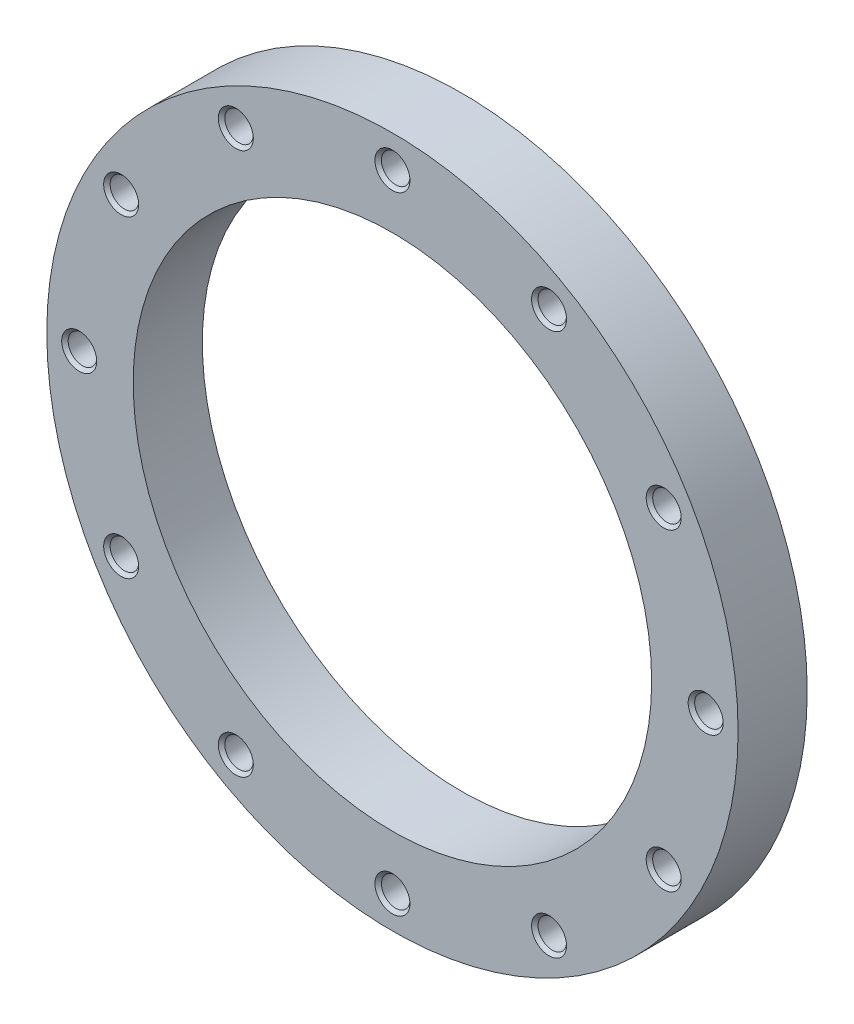
ISO-10303-21;
HEADER;
FILE_DESCRIPTION(('STEP AP214'),'2;1');
FILE_NAME('part.step','',(''),(''),'','','');
FILE_SCHEMA(('AUTOMOTIVE_DESIGN { 1 0 10303 214 1 1 1 1 }'));
ENDSEC;
DATA;
#1=APPLICATION_CONTEXT('core data for automotive mechanical design processes');
#2=APPLICATION_PROTOCOL_DEFINITION('international standard','automotive_design',2000,#1);
#3=PRODUCT_CONTEXT('',#1,'mechanical');
#4=PRODUCT('Part','Part','',(#3));
#5=PRODUCT_RELATED_PRODUCT_CATEGORY('part','',(#4));
#6=PRODUCT_DEFINITION_FORMATION('','',#4);
#7=PRODUCT_DEFINITION_CONTEXT('part definition',#1,'design');
#8=PRODUCT_DEFINITION('design','',#6,#7);
#9=PRODUCT_DEFINITION_SHAPE('','',#8);
#10=(LENGTH_UNIT() NAMED_UNIT(*) SI_UNIT(.MILLI.,.METRE.));
#11=(NAMED_UNIT(*) PLANE_ANGLE_UNIT() SI_UNIT($,.RADIAN.));
#12=(NAMED_UNIT(*) SI_UNIT($,.STERADIAN.) SOLID_ANGLE_UNIT());
#13=UNCERTAINTY_MEASURE_WITH_UNIT(LENGTH_MEASURE(1.E-05),#10,'distance_accuracy_value','');
#14=(GEOMETRIC_REPRESENTATION_CONTEXT(3) GLOBAL_UNCERTAINTY_ASSIGNED_CONTEXT((#13)) GLOBAL_UNIT_ASSIGNED_CONTEXT((#10,
#11,#12)) REPRESENTATION_CONTEXT('',''));
#15=CARTESIAN_POINT('',(0.,0.,0.));
#16=DIRECTION('',(0.,0.,1.));
#17=DIRECTION('',(1.,0.,0.));
#18=AXIS2_PLACEMENT_3D('',#15,#16,#17);
#19=CARTESIAN_POINT('',(0.,0.,-8.));
#20=DIRECTION('',(0.,0.,1.));
#21=DIRECTION('',(1.,0.,0.));
#22=AXIS2_PLACEMENT_3D('',#19,#20,#21);
#23=CYLINDRICAL_SURFACE('',#22,40.);
#24=CARTESIAN_POINT('',(0.,0.,-8.));
#25=DIRECTION('',(0.,0.,1.));
#26=DIRECTION('',(1.,0.,0.));
#27=AXIS2_PLACEMENT_3D('',#24,#25,#26);
#28=CIRCLE('',#27,40.);
#29=CARTESIAN_POINT('',(40.,0.,-8.));
#30=VERTEX_POINT('',#29);
#31=EDGE_CURVE('E10',#30,#30,#28,.T.);
#32=ORIENTED_EDGE('',*,*,#31,.T.);
#33=EDGE_LOOP('',(#32));
#34=FACE_BOUND('',#33,.T.);
#35=CARTESIAN_POINT('',(0.,0.,0.));
#36=DIRECTION('',(0.,0.,1.));
#37=DIRECTION('',(1.,0.,0.));
#38=AXIS2_PLACEMENT_3D('',#35,#36,#37);
#39=CIRCLE('',#38,40.);
#40=CARTESIAN_POINT('',(40.,0.,0.));
#41=VERTEX_POINT('',#40);
#42=EDGE_CURVE('E44',#41,#41,#39,.T.);
#43=ORIENTED_EDGE('',*,*,#42,.F.);
#44=EDGE_LOOP('',(#43));
#45=FACE_BOUND('',#44,.T.);
#46=ADVANCED_FACE('F41',(#34,#45),#23,.T.);
#47=CARTESIAN_POINT('',(0.,0.,-8.));
#48=DIRECTION('',(0.,0.,1.));
#49=DIRECTION('',(1.,0.,0.));
#50=AXIS2_PLACEMENT_3D('',#47,#48,#49);
#51=PLANE('',#50);
#52=CARTESIAN_POINT('',(-18.1249999999996,31.3934208871861,-8.));
#53=DIRECTION('',(0.,0.,1.));
#54=DIRECTION('',(1.,0.,0.));
#55=AXIS2_PLACEMENT_3D('',#52,#53,#54);
#56=CIRCLE('',#55,1.65);
#57=CARTESIAN_POINT('',(-16.4749999999996,31.3934208871861,-8.));
#58=VERTEX_POINT('',#57);
#59=EDGE_CURVE('E194',#58,#58,#56,.T.);
#60=ORIENTED_EDGE('',*,*,#59,.T.);
#61=EDGE_LOOP('',(#60));
#62=FACE_BOUND('',#61,.T.);
#63=CARTESIAN_POINT('',(-31.3934208871857,18.1250000000004,-8.));
#64=DIRECTION('',(0.,0.,1.));
#65=DIRECTION('',(1.,0.,0.));
#66=AXIS2_PLACEMENT_3D('',#63,#64,#65);
#67=CIRCLE('',#66,1.65);
#68=CARTESIAN_POINT('',(-29.7434208871857,18.1250000000004,-8.));
#69=VERTEX_POINT('',#68);
#70=EDGE_CURVE('E182',#69,#69,#67,.T.);
#71=ORIENTED_EDGE('',*,*,#70,.T.);
#72=EDGE_LOOP('',(#71));
#73=FACE_BOUND('',#72,.T.);
#74=CARTESIAN_POINT('',(-36.25,3.79698595599191E-13,-8.));
#75=DIRECTION('',(0.,0.,1.));
#76=DIRECTION('',(1.,0.,0.));
#77=AXIS2_PLACEMENT_3D('',#74,#75,#76);
#78=CIRCLE('',#77,1.65);
#79=CARTESIAN_POINT('',(-34.6,3.79698595599191E-13,-8.));
#80=VERTEX_POINT('',#79);
#81=EDGE_CURVE('E170',#80,#80,#78,.T.);
#82=ORIENTED_EDGE('',*,*,#81,.T.);
#83=EDGE_LOOP('',(#82));
#84=FACE_BOUND('',#83,.T.);
#85=CARTESIAN_POINT('',(-31.3934208871861,-18.1249999999997,-8.));
#86=DIRECTION('',(0.,0.,1.));
#87=DIRECTION('',(1.,0.,0.));
#88=AXIS2_PLACEMENT_3D('',#85,#86,#87);
#89=CIRCLE('',#88,1.65);
#90=CARTESIAN_POINT('',(-29.7434208871861,-18.1249999999997,-8.));
#91=VERTEX_POINT('',#90);
#92=EDGE_CURVE('E158',#91,#91,#89,.T.);
#93=ORIENTED_EDGE('',*,*,#92,.T.);
#94=EDGE_LOOP('',(#93));
#95=FACE_BOUND('',#94,.T.);
#96=CARTESIAN_POINT('',(-18.1250000000003,-31.3934208871858,-8.));
#97=DIRECTION('',(0.,0.,1.));
#98=DIRECTION('',(1.,0.,0.));
#99=AXIS2_PLACEMENT_3D('',#96,#97,#98);
#100=CIRCLE('',#99,1.65);
#101=CARTESIAN_POINT('',(-16.4750000000003,-31.3934208871858,-8.));
#102=VERTEX_POINT('',#101);
#103=EDGE_CURVE('E146',#102,#102,#100,.T.);
#104=ORIENTED_EDGE('',*,*,#103,.T.);
#105=EDGE_LOOP('',(#104));
#106=FACE_BOUND('',#105,.T.);
#107=CARTESIAN_POINT('',(0.,-36.25,-8.));
#108=DIRECTION('',(0.,0.,1.));
#109=DIRECTION('',(1.,0.,0.));
#110=AXIS2_PLACEMENT_3D('',#107,#108,#109);
#111=CIRCLE('',#110,1.65);
#112=CARTESIAN_POINT('',(1.65,-36.25,-8.));
#113=VERTEX_POINT('',#112);
#114=EDGE_CURVE('E134',#113,#113,#111,.T.);
#115=ORIENTED_EDGE('',*,*,#114,.T.);
#116=EDGE_LOOP('',(#115));
#117=FACE_BOUND('',#116,.T.);
#118=CARTESIAN_POINT('',(18.1249999999998,-31.393420887186,-8.));
#119=DIRECTION('',(0.,0.,1.));
#120=DIRECTION('',(1.,0.,0.));
#121=AXIS2_PLACEMENT_3D('',#118,#119,#120);
#122=CIRCLE('',#121,1.65);
#123=CARTESIAN_POINT('',(19.7749999999998,-31.393420887186,-8.));
#124=VERTEX_POINT('',#123);
#125=EDGE_CURVE('E122',#124,#124,#122,.T.);
#126=ORIENTED_EDGE('',*,*,#125,.T.);
#127=EDGE_LOOP('',(#126));
#128=FACE_BOUND('',#127,.T.);
#129=CARTESIAN_POINT('',(31.3934208871858,-18.1250000000001,-8.));
#130=DIRECTION('',(0.,0.,1.));
#131=DIRECTION('',(1.,0.,0.));
#132=AXIS2_PLACEMENT_3D('',#129,#130,#131);
#133=CIRCLE('',#132,1.65);
#134=CARTESIAN_POINT('',(33.0434208871858,-18.1250000000001,-8.));
#135=VERTEX_POINT('',#134);
#136=EDGE_CURVE('E110',#135,#135,#133,.T.);
#137=ORIENTED_EDGE('',*,*,#136,.T.);
#138=EDGE_LOOP('',(#137));
#139=FACE_BOUND('',#138,.T.);
#140=CARTESIAN_POINT('',(36.25,-1.26566198533064E-13,-8.));
#141=DIRECTION('',(0.,0.,1.));
#142=DIRECTION('',(1.,0.,0.));
#143=AXIS2_PLACEMENT_3D('',#140,#141,#142);
#144=CIRCLE('',#143,1.65);
#145=CARTESIAN_POINT('',(37.9,-1.26566198533064E-13,-8.));
#146=VERTEX_POINT('',#145);
#147=EDGE_CURVE('E98',#146,#146,#144,.T.);
#148=ORIENTED_EDGE('',*,*,#147,.T.);
#149=EDGE_LOOP('',(#148));
#150=FACE_BOUND('',#149,.T.);
#151=CARTESIAN_POINT('',(31.3934208871859,18.1249999999999,-8.));
#152=DIRECTION('',(0.,0.,1.));
#153=DIRECTION('',(1.,0.,0.));
#154=AXIS2_PLACEMENT_3D('',#151,#152,#153);
#155=CIRCLE('',#154,1.65);
#156=CARTESIAN_POINT('',(33.0434208871859,18.1249999999999,-8.));
#157=VERTEX_POINT('',#156);
#158=EDGE_CURVE('E86',#157,#157,#155,.T.);
#159=ORIENTED_EDGE('',*,*,#158,.T.);
#160=EDGE_LOOP('',(#159));
#161=FACE_BOUND('',#160,.T.);
#162=CARTESIAN_POINT('',(18.125,31.3934208871859,-8.));
#163=DIRECTION('',(0.,0.,1.));
#164=DIRECTION('',(1.,0.,0.));
#165=AXIS2_PLACEMENT_3D('',#162,#163,#164);
#166=CIRCLE('',#165,1.65);
#167=CARTESIAN_POINT('',(19.775,31.3934208871859,-8.));
#168=VERTEX_POINT('',#167);
#169=EDGE_CURVE('E74',#168,#168,#166,.T.);
#170=ORIENTED_EDGE('',*,*,#169,.T.);
#171=EDGE_LOOP('',(#170));
#172=FACE_BOUND('',#171,.T.);
#173=CARTESIAN_POINT('',(0.,36.25,-8.));
#174=DIRECTION('',(0.,0.,1.));
#175=DIRECTION('',(1.,0.,0.));
#176=AXIS2_PLACEMENT_3D('',#173,#174,#175);
#177=CIRCLE('',#176,1.65);
#178=CARTESIAN_POINT('',(1.65,36.25,-8.));
#179=VERTEX_POINT('',#178);
#180=EDGE_CURVE('E59',#179,#179,#177,.T.);
#181=ORIENTED_EDGE('',*,*,#180,.T.);
#182=EDGE_LOOP('',(#181));
#183=FACE_BOUND('',#182,.T.);
#184=CARTESIAN_POINT('',(0.,0.,-8.));
#185=DIRECTION('',(0.,0.,1.));
#186=DIRECTION('',(1.,0.,0.));
#187=AXIS2_PLACEMENT_3D('',#184,#185,#186);
#188=CIRCLE('',#187,30.);
#189=CARTESIAN_POINT('',(30.,0.,-8.));
#190=VERTEX_POINT('',#189);
#191=EDGE_CURVE('E53',#190,#190,#188,.T.);
#192=ORIENTED_EDGE('',*,*,#191,.T.);
#193=EDGE_LOOP('',(#192));
#194=FACE_BOUND('',#193,.T.);
#195=ORIENTED_EDGE('',*,*,#31,.F.);
#196=EDGE_LOOP('',(#195));
#197=FACE_BOUND('',#196,.T.);
#198=ADVANCED_FACE('F213',(#62,#73,#84,#95,#106,#117,#128,#139,#150,#161,#172,#183,#194,#197),
#51,.F.);
#199=CARTESIAN_POINT('',(0.,0.,0.));
#200=DIRECTION('',(0.,0.,1.));
#201=DIRECTION('',(1.,0.,0.));
#202=AXIS2_PLACEMENT_3D('',#199,#200,#201);
#203=PLANE('',#202);
#204=CARTESIAN_POINT('',(-18.1249999999996,31.3934208871861,0.));
#205=DIRECTION('',(0.,0.,1.));
#206=DIRECTION('',(1.,0.,0.));
#207=AXIS2_PLACEMENT_3D('',#204,#205,#206);
#208=CIRCLE('',#207,2.025);
#209=CARTESIAN_POINT('',(-16.0999999999996,31.3934208871861,0.));
#210=VERTEX_POINT('',#209);
#211=EDGE_CURVE('E202',#210,#210,#208,.T.);
#212=ORIENTED_EDGE('',*,*,#211,.F.);
#213=EDGE_LOOP('',(#212));
#214=FACE_BOUND('',#213,.T.);
#215=CARTESIAN_POINT('',(-31.3934208871857,18.1250000000004,0.));
#216=DIRECTION('',(0.,0.,1.));
#217=DIRECTION('',(1.,0.,0.));
#218=AXIS2_PLACEMENT_3D('',#215,#216,#217);
#219=CIRCLE('',#218,2.025);
#220=CARTESIAN_POINT('',(-29.3684208871857,18.1250000000004,0.));
#221=VERTEX_POINT('',#220);
#222=EDGE_CURVE('E190',#221,#221,#219,.T.);
#223=ORIENTED_EDGE('',*,*,#222,.F.);
#224=EDGE_LOOP('',(#223));
#225=FACE_BOUND('',#224,.T.);
#226=CARTESIAN_POINT('',(-36.25,3.79698595599191E-13,0.));
#227=DIRECTION('',(0.,0.,1.));
#228=DIRECTION('',(1.,0.,0.));
#229=AXIS2_PLACEMENT_3D('',#226,#227,#228);
#230=CIRCLE('',#229,2.025);
#231=CARTESIAN_POINT('',(-34.225,3.79698595599191E-13,0.));
#232=VERTEX_POINT('',#231);
#233=EDGE_CURVE('E178',#232,#232,#230,.T.);
#234=ORIENTED_EDGE('',*,*,#233,.F.);
#235=EDGE_LOOP('',(#234));
#236=FACE_BOUND('',#235,.T.);
#237=CARTESIAN_POINT('',(-31.3934208871861,-18.1249999999997,0.));
#238=DIRECTION('',(0.,0.,1.));
#239=DIRECTION('',(1.,0.,0.));
#240=AXIS2_PLACEMENT_3D('',#237,#238,#239);
#241=CIRCLE('',#240,2.025);
#242=CARTESIAN_POINT('',(-29.3684208871861,-18.1249999999997,0.));
#243=VERTEX_POINT('',#242);
#244=EDGE_CURVE('E166',#243,#243,#241,.T.);
#245=ORIENTED_EDGE('',*,*,#244,.F.);
#246=EDGE_LOOP('',(#245));
#247=FACE_BOUND('',#246,.T.);
#248=CARTESIAN_POINT('',(-18.1250000000003,-31.3934208871858,0.));
#249=DIRECTION('',(0.,0.,1.));
#250=DIRECTION('',(1.,0.,0.));
#251=AXIS2_PLACEMENT_3D('',#248,#249,#250);
#252=CIRCLE('',#251,2.025);
#253=CARTESIAN_POINT('',(-16.1000000000003,-31.3934208871858,0.));
#254=VERTEX_POINT('',#253);
#255=EDGE_CURVE('E154',#254,#254,#252,.T.);
#256=ORIENTED_EDGE('',*,*,#255,.F.);
#257=EDGE_LOOP('',(#256));
#258=FACE_BOUND('',#257,.T.);
#259=CARTESIAN_POINT('',(0.,-36.25,0.));
#260=DIRECTION('',(0.,0.,1.));
#261=DIRECTION('',(1.,0.,0.));
#262=AXIS2_PLACEMENT_3D('',#259,#260,#261);
#263=CIRCLE('',#262,2.025);
#264=CARTESIAN_POINT('',(2.025,-36.25,0.));
#265=VERTEX_POINT('',#264);
#266=EDGE_CURVE('E142',#265,#265,#263,.T.);
#267=ORIENTED_EDGE('',*,*,#266,.F.);
#268=EDGE_LOOP('',(#267));
#269=FACE_BOUND('',#268,.T.);
#270=CARTESIAN_POINT('',(18.1249999999998,-31.393420887186,0.));
#271=DIRECTION('',(0.,0.,1.));
#272=DIRECTION('',(1.,0.,0.));
#273=AXIS2_PLACEMENT_3D('',#270,#271,#272);
#274=CIRCLE('',#273,2.025);
#275=CARTESIAN_POINT('',(20.1499999999998,-31.393420887186,0.));
#276=VERTEX_POINT('',#275);
#277=EDGE_CURVE('E130',#276,#276,#274,.T.);
#278=ORIENTED_EDGE('',*,*,#277,.F.);
#279=EDGE_LOOP('',(#278));
#280=FACE_BOUND('',#279,.T.);
#281=CARTESIAN_POINT('',(31.3934208871858,-18.1250000000001,0.));
#282=DIRECTION('',(0.,0.,1.));
#283=DIRECTION('',(1.,0.,0.));
#284=AXIS2_PLACEMENT_3D('',#281,#282,#283);
#285=CIRCLE('',#284,2.025);
#286=CARTESIAN_POINT('',(33.4184208871858,-18.1250000000001,0.));
#287=VERTEX_POINT('',#286);
#288=EDGE_CURVE('E118',#287,#287,#285,.T.);
#289=ORIENTED_EDGE('',*,*,#288,.F.);
#290=EDGE_LOOP('',(#289));
#291=FACE_BOUND('',#290,.T.);
#292=CARTESIAN_POINT('',(36.25,-1.26566198533064E-13,0.));
#293=DIRECTION('',(0.,0.,1.));
#294=DIRECTION('',(1.,0.,0.));
#295=AXIS2_PLACEMENT_3D('',#292,#293,#294);
#296=CIRCLE('',#295,2.025);
#297=CARTESIAN_POINT('',(38.275,-1.26566198533064E-13,0.));
#298=VERTEX_POINT('',#297);
#299=EDGE_CURVE('E106',#298,#298,#296,.T.);
#300=ORIENTED_EDGE('',*,*,#299,.F.);
#301=EDGE_LOOP('',(#300));
#302=FACE_BOUND('',#301,.T.);
#303=CARTESIAN_POINT('',(31.3934208871859,18.1249999999999,0.));
#304=DIRECTION('',(0.,0.,1.));
#305=DIRECTION('',(1.,0.,0.));
#306=AXIS2_PLACEMENT_3D('',#303,#304,#305);
#307=CIRCLE('',#306,2.025);
#308=CARTESIAN_POINT('',(33.4184208871859,18.1249999999999,0.));
#309=VERTEX_POINT('',#308);
#310=EDGE_CURVE('E94',#309,#309,#307,.T.);
#311=ORIENTED_EDGE('',*,*,#310,.F.);
#312=EDGE_LOOP('',(#311));
#313=FACE_BOUND('',#312,.T.);
#314=CARTESIAN_POINT('',(18.125,31.3934208871859,0.));
#315=DIRECTION('',(0.,0.,1.));
#316=DIRECTION('',(1.,0.,0.));
#317=AXIS2_PLACEMENT_3D('',#314,#315,#316);
#318=CIRCLE('',#317,2.025);
#319=CARTESIAN_POINT('',(20.15,31.3934208871859,0.));
#320=VERTEX_POINT('',#319);
#321=EDGE_CURVE('E82',#320,#320,#318,.T.);
#322=ORIENTED_EDGE('',*,*,#321,.F.);
#323=EDGE_LOOP('',(#322));
#324=FACE_BOUND('',#323,.T.);
#325=CARTESIAN_POINT('',(0.,36.25,0.));
#326=DIRECTION('',(0.,0.,1.));
#327=DIRECTION('',(1.,0.,0.));
#328=AXIS2_PLACEMENT_3D('',#325,#326,#327);
#329=CIRCLE('',#328,2.025);
#330=CARTESIAN_POINT('',(2.025,36.25,0.));
#331=VERTEX_POINT('',#330);
#332=EDGE_CURVE('E70',#331,#331,#329,.T.);
#333=ORIENTED_EDGE('',*,*,#332,.F.);
#334=EDGE_LOOP('',(#333));
#335=FACE_BOUND('',#334,.T.);
#336=CARTESIAN_POINT('',(0.,0.,0.));
#337=DIRECTION('',(0.,0.,1.));
#338=DIRECTION('',(1.,0.,0.));
#339=AXIS2_PLACEMENT_3D('',#336,#337,#338);
#340=CIRCLE('',#339,30.);
#341=CARTESIAN_POINT('',(30.,0.,0.));
#342=VERTEX_POINT('',#341);
#343=EDGE_CURVE('E55',#342,#342,#340,.T.);
#344=ORIENTED_EDGE('',*,*,#343,.F.);
#345=EDGE_LOOP('',(#344));
#346=FACE_BOUND('',#345,.T.);
#347=ORIENTED_EDGE('',*,*,#42,.T.);
#348=EDGE_LOOP('',(#347));
#349=FACE_BOUND('',#348,.T.);
#350=ADVANCED_FACE('F209',(#214,#225,#236,#247,#258,#269,#280,#291,#302,#313,#324,#335,#346,
#349),#203,.T.);
#351=CARTESIAN_POINT('',(0.,0.,-8.));
#352=DIRECTION('',(0.,0.,1.));
#353=DIRECTION('',(1.,0.,0.));
#354=AXIS2_PLACEMENT_3D('',#351,#352,#353);
#355=CYLINDRICAL_SURFACE('',#354,30.);
#356=ORIENTED_EDGE('',*,*,#191,.F.);
#357=EDGE_LOOP('',(#356));
#358=FACE_BOUND('',#357,.T.);
#359=ORIENTED_EDGE('',*,*,#343,.T.);
#360=EDGE_LOOP('',(#359));
#361=FACE_BOUND('',#360,.T.);
#362=ADVANCED_FACE('F212',(#358,#361),#355,.F.);
#363=CARTESIAN_POINT('',(0.,36.25,0.));
#364=DIRECTION('',(0.,0.,1.));
#365=DIRECTION('',(1.,0.,0.));
#366=AXIS2_PLACEMENT_3D('',#363,#364,#365);
#367=CYLINDRICAL_SURFACE('',#366,1.65);
#368=ORIENTED_EDGE('',*,*,#180,.F.);
#369=EDGE_LOOP('',(#368));
#370=FACE_BOUND('',#369,.T.);
#371=CARTESIAN_POINT('',(0.,36.25,-0.375000000000001));
#372=DIRECTION('',(0.,0.,1.));
#373=DIRECTION('',(1.,0.,0.));
#374=AXIS2_PLACEMENT_3D('',#371,#372,#373);
#375=CIRCLE('',#374,1.65);
#376=CARTESIAN_POINT('',(1.65,36.25,-0.375000000000001));
#377=VERTEX_POINT('',#376);
#378=EDGE_CURVE('E66',#377,#377,#375,.T.);
#379=ORIENTED_EDGE('',*,*,#378,.T.);
#380=EDGE_LOOP('',(#379));
#381=FACE_BOUND('',#380,.T.);
#382=ADVANCED_FACE('F252',(#370,#381),#367,.F.);
#383=CARTESIAN_POINT('',(0.,36.25,0.));
#384=DIRECTION('',(0.,0.,1.));
#385=DIRECTION('',(1.,0.,0.));
#386=AXIS2_PLACEMENT_3D('',#383,#384,#385);
#387=CONICAL_SURFACE('',#386,2.025,0.785398163397445);
#388=ORIENTED_EDGE('',*,*,#378,.F.);
#389=EDGE_LOOP('',(#388));
#390=FACE_BOUND('',#389,.T.);
#391=ORIENTED_EDGE('',*,*,#332,.T.);
#392=EDGE_LOOP('',(#391));
#393=FACE_BOUND('',#392,.T.);
#394=ADVANCED_FACE('F256',(#390,#393),#387,.F.);
#395=CARTESIAN_POINT('',(18.125,31.3934208871859,0.));
#396=DIRECTION('',(0.,0.,1.));
#397=DIRECTION('',(1.,0.,0.));
#398=AXIS2_PLACEMENT_3D('',#395,#396,#397);
#399=CYLINDRICAL_SURFACE('',#398,1.65);
#400=ORIENTED_EDGE('',*,*,#169,.F.);
#401=EDGE_LOOP('',(#400));
#402=FACE_BOUND('',#401,.T.);
#403=CARTESIAN_POINT('',(18.125,31.3934208871859,-0.375000000000001));
#404=DIRECTION('',(0.,0.,1.));
#405=DIRECTION('',(1.,0.,0.));
#406=AXIS2_PLACEMENT_3D('',#403,#404,#405);
#407=CIRCLE('',#406,1.65);
#408=CARTESIAN_POINT('',(19.775,31.3934208871859,-0.375000000000001));
#409=VERTEX_POINT('',#408);
#410=EDGE_CURVE('E78',#409,#409,#407,.T.);
#411=ORIENTED_EDGE('',*,*,#410,.T.);
#412=EDGE_LOOP('',(#411));
#413=FACE_BOUND('',#412,.T.);
#414=ADVANCED_FACE('F260',(#402,#413),#399,.F.);
#415=CARTESIAN_POINT('',(18.125,31.3934208871859,0.));
#416=DIRECTION('',(0.,0.,1.));
#417=DIRECTION('',(1.,0.,0.));
#418=AXIS2_PLACEMENT_3D('',#415,#416,#417);
#419=CONICAL_SURFACE('',#418,2.025,0.785398163397445);
#420=ORIENTED_EDGE('',*,*,#410,.F.);
#421=EDGE_LOOP('',(#420));
#422=FACE_BOUND('',#421,.T.);
#423=ORIENTED_EDGE('',*,*,#321,.T.);
#424=EDGE_LOOP('',(#423));
#425=FACE_BOUND('',#424,.T.);
#426=ADVANCED_FACE('F264',(#422,#425),#419,.F.);
#427=CARTESIAN_POINT('',(31.3934208871859,18.1249999999999,0.));
#428=DIRECTION('',(0.,0.,1.));
#429=DIRECTION('',(1.,0.,0.));
#430=AXIS2_PLACEMENT_3D('',#427,#428,#429);
#431=CYLINDRICAL_SURFACE('',#430,1.65);
#432=ORIENTED_EDGE('',*,*,#158,.F.);
#433=EDGE_LOOP('',(#432));
#434=FACE_BOUND('',#433,.T.);
#435=CARTESIAN_POINT('',(31.3934208871859,18.1249999999999,-0.375000000000001));
#436=DIRECTION('',(0.,0.,1.));
#437=DIRECTION('',(1.,0.,0.));
#438=AXIS2_PLACEMENT_3D('',#435,#436,#437);
#439=CIRCLE('',#438,1.65);
#440=CARTESIAN_POINT('',(33.0434208871859,18.1249999999999,-0.375000000000001));
#441=VERTEX_POINT('',#440);
#442=EDGE_CURVE('E90',#441,#441,#439,.T.);
#443=ORIENTED_EDGE('',*,*,#442,.T.);
#444=EDGE_LOOP('',(#443));
#445=FACE_BOUND('',#444,.T.);
#446=ADVANCED_FACE('F268',(#434,#445),#431,.F.);
#447=CARTESIAN_POINT('',(31.3934208871859,18.1249999999999,0.));
#448=DIRECTION('',(0.,0.,1.));
#449=DIRECTION('',(1.,0.,0.));
#450=AXIS2_PLACEMENT_3D('',#447,#448,#449);
#451=CONICAL_SURFACE('',#450,2.025,0.785398163397445);
#452=ORIENTED_EDGE('',*,*,#442,.F.);
#453=EDGE_LOOP('',(#452));
#454=FACE_BOUND('',#453,.T.);
#455=ORIENTED_EDGE('',*,*,#310,.T.);
#456=EDGE_LOOP('',(#455));
#457=FACE_BOUND('',#456,.T.);
#458=ADVANCED_FACE('F272',(#454,#457),#451,.F.);
#459=CARTESIAN_POINT('',(36.25,-1.26566198533064E-13,0.));
#460=DIRECTION('',(0.,0.,1.));
#461=DIRECTION('',(1.,0.,0.));
#462=AXIS2_PLACEMENT_3D('',#459,#460,#461);
#463=CYLINDRICAL_SURFACE('',#462,1.65);
#464=ORIENTED_EDGE('',*,*,#147,.F.);
#465=EDGE_LOOP('',(#464));
#466=FACE_BOUND('',#465,.T.);
#467=CARTESIAN_POINT('',(36.25,-1.26566198533064E-13,-0.375000000000001));
#468=DIRECTION('',(0.,0.,1.));
#469=DIRECTION('',(1.,0.,0.));
#470=AXIS2_PLACEMENT_3D('',#467,#468,#469);
#471=CIRCLE('',#470,1.65);
#472=CARTESIAN_POINT('',(37.9,-1.26566198533064E-13,-0.375000000000001));
#473=VERTEX_POINT('',#472);
#474=EDGE_CURVE('E102',#473,#473,#471,.T.);
#475=ORIENTED_EDGE('',*,*,#474,.T.);
#476=EDGE_LOOP('',(#475));
#477=FACE_BOUND('',#476,.T.);
#478=ADVANCED_FACE('F276',(#466,#477),#463,.F.);
#479=CARTESIAN_POINT('',(36.25,-1.26566198533064E-13,0.));
#480=DIRECTION('',(0.,0.,1.));
#481=DIRECTION('',(1.,0.,0.));
#482=AXIS2_PLACEMENT_3D('',#479,#480,#481);
#483=CONICAL_SURFACE('',#482,2.025,0.785398163397445);
#484=ORIENTED_EDGE('',*,*,#474,.F.);
#485=EDGE_LOOP('',(#484));
#486=FACE_BOUND('',#485,.T.);
#487=ORIENTED_EDGE('',*,*,#299,.T.);
#488=EDGE_LOOP('',(#487));
#489=FACE_BOUND('',#488,.T.);
#490=ADVANCED_FACE('F280',(#486,#489),#483,.F.);
#491=CARTESIAN_POINT('',(31.3934208871858,-18.1250000000001,0.));
#492=DIRECTION('',(0.,0.,1.));
#493=DIRECTION('',(1.,0.,0.));
#494=AXIS2_PLACEMENT_3D('',#491,#492,#493);
#495=CYLINDRICAL_SURFACE('',#494,1.65);
#496=ORIENTED_EDGE('',*,*,#136,.F.);
#497=EDGE_LOOP('',(#496));
#498=FACE_BOUND('',#497,.T.);
#499=CARTESIAN_POINT('',(31.3934208871858,-18.1250000000001,-0.375000000000001));
#500=DIRECTION('',(0.,0.,1.));
#501=DIRECTION('',(1.,0.,0.));
#502=AXIS2_PLACEMENT_3D('',#499,#500,#501);
#503=CIRCLE('',#502,1.65);
#504=CARTESIAN_POINT('',(33.0434208871858,-18.1250000000001,-0.375000000000001));
#505=VERTEX_POINT('',#504);
#506=EDGE_CURVE('E114',#505,#505,#503,.T.);
#507=ORIENTED_EDGE('',*,*,#506,.T.);
#508=EDGE_LOOP('',(#507));
#509=FACE_BOUND('',#508,.T.);
#510=ADVANCED_FACE('F284',(#498,#509),#495,.F.);
#511=CARTESIAN_POINT('',(31.3934208871858,-18.1250000000001,0.));
#512=DIRECTION('',(0.,0.,1.));
#513=DIRECTION('',(1.,0.,0.));
#514=AXIS2_PLACEMENT_3D('',#511,#512,#513);
#515=CONICAL_SURFACE('',#514,2.025,0.785398163397445);
#516=ORIENTED_EDGE('',*,*,#506,.F.);
#517=EDGE_LOOP('',(#516));
#518=FACE_BOUND('',#517,.T.);
#519=ORIENTED_EDGE('',*,*,#288,.T.);
#520=EDGE_LOOP('',(#519));
#521=FACE_BOUND('',#520,.T.);
#522=ADVANCED_FACE('F288',(#518,#521),#515,.F.);
#523=CARTESIAN_POINT('',(18.1249999999998,-31.393420887186,0.));
#524=DIRECTION('',(0.,0.,1.));
#525=DIRECTION('',(1.,0.,0.));
#526=AXIS2_PLACEMENT_3D('',#523,#524,#525);
#527=CYLINDRICAL_SURFACE('',#526,1.65);
#528=ORIENTED_EDGE('',*,*,#125,.F.);
#529=EDGE_LOOP('',(#528));
#530=FACE_BOUND('',#529,.T.);
#531=CARTESIAN_POINT('',(18.1249999999998,-31.393420887186,-0.375000000000001));
#532=DIRECTION('',(0.,0.,1.));
#533=DIRECTION('',(1.,0.,0.));
#534=AXIS2_PLACEMENT_3D('',#531,#532,#533);
#535=CIRCLE('',#534,1.65);
#536=CARTESIAN_POINT('',(19.7749999999998,-31.393420887186,-0.375000000000001));
#537=VERTEX_POINT('',#536);
#538=EDGE_CURVE('E126',#537,#537,#535,.T.);
#539=ORIENTED_EDGE('',*,*,#538,.T.);
#540=EDGE_LOOP('',(#539));
#541=FACE_BOUND('',#540,.T.);
#542=ADVANCED_FACE('F292',(#530,#541),#527,.F.);
#543=CARTESIAN_POINT('',(18.1249999999998,-31.393420887186,0.));
#544=DIRECTION('',(0.,0.,1.));
#545=DIRECTION('',(1.,0.,0.));
#546=AXIS2_PLACEMENT_3D('',#543,#544,#545);
#547=CONICAL_SURFACE('',#546,2.025,0.785398163397445);
#548=ORIENTED_EDGE('',*,*,#538,.F.);
#549=EDGE_LOOP('',(#548));
#550=FACE_BOUND('',#549,.T.);
#551=ORIENTED_EDGE('',*,*,#277,.T.);
#552=EDGE_LOOP('',(#551));
#553=FACE_BOUND('',#552,.T.);
#554=ADVANCED_FACE('F296',(#550,#553),#547,.F.);
#555=CARTESIAN_POINT('',(0.,-36.25,0.));
#556=DIRECTION('',(0.,0.,1.));
#557=DIRECTION('',(1.,0.,0.));
#558=AXIS2_PLACEMENT_3D('',#555,#556,#557);
#559=CYLINDRICAL_SURFACE('',#558,1.65);
#560=ORIENTED_EDGE('',*,*,#114,.F.);
#561=EDGE_LOOP('',(#560));
#562=FACE_BOUND('',#561,.T.);
#563=CARTESIAN_POINT('',(0.,-36.25,-0.375000000000001));
#564=DIRECTION('',(0.,0.,1.));
#565=DIRECTION('',(1.,0.,0.));
#566=AXIS2_PLACEMENT_3D('',#563,#564,#565);
#567=CIRCLE('',#566,1.65);
#568=CARTESIAN_POINT('',(1.65,-36.25,-0.375000000000001));
#569=VERTEX_POINT('',#568);
#570=EDGE_CURVE('E138',#569,#569,#567,.T.);
#571=ORIENTED_EDGE('',*,*,#570,.T.);
#572=EDGE_LOOP('',(#571));
#573=FACE_BOUND('',#572,.T.);
#574=ADVANCED_FACE('F300',(#562,#573),#559,.F.);
#575=CARTESIAN_POINT('',(0.,-36.25,0.));
#576=DIRECTION('',(0.,0.,1.));
#577=DIRECTION('',(1.,0.,0.));
#578=AXIS2_PLACEMENT_3D('',#575,#576,#577);
#579=CONICAL_SURFACE('',#578,2.025,0.785398163397445);
#580=ORIENTED_EDGE('',*,*,#570,.F.);
#581=EDGE_LOOP('',(#580));
#582=FACE_BOUND('',#581,.T.);
#583=ORIENTED_EDGE('',*,*,#266,.T.);
#584=EDGE_LOOP('',(#583));
#585=FACE_BOUND('',#584,.T.);
#586=ADVANCED_FACE('F304',(#582,#585),#579,.F.);
#587=CARTESIAN_POINT('',(-18.1250000000003,-31.3934208871858,0.));
#588=DIRECTION('',(0.,0.,1.));
#589=DIRECTION('',(1.,0.,0.));
#590=AXIS2_PLACEMENT_3D('',#587,#588,#589);
#591=CYLINDRICAL_SURFACE('',#590,1.65);
#592=ORIENTED_EDGE('',*,*,#103,.F.);
#593=EDGE_LOOP('',(#592));
#594=FACE_BOUND('',#593,.T.);
#595=CARTESIAN_POINT('',(-18.1250000000003,-31.3934208871858,-0.375000000000001));
#596=DIRECTION('',(0.,0.,1.));
#597=DIRECTION('',(1.,0.,0.));
#598=AXIS2_PLACEMENT_3D('',#595,#596,#597);
#599=CIRCLE('',#598,1.65);
#600=CARTESIAN_POINT('',(-16.4750000000003,-31.3934208871858,-0.375000000000001));
#601=VERTEX_POINT('',#600);
#602=EDGE_CURVE('E150',#601,#601,#599,.T.);
#603=ORIENTED_EDGE('',*,*,#602,.T.);
#604=EDGE_LOOP('',(#603));
#605=FACE_BOUND('',#604,.T.);
#606=ADVANCED_FACE('F308',(#594,#605),#591,.F.);
#607=CARTESIAN_POINT('',(-18.1250000000003,-31.3934208871858,0.));
#608=DIRECTION('',(0.,0.,1.));
#609=DIRECTION('',(1.,0.,0.));
#610=AXIS2_PLACEMENT_3D('',#607,#608,#609);
#611=CONICAL_SURFACE('',#610,2.025,0.785398163397445);
#612=ORIENTED_EDGE('',*,*,#602,.F.);
#613=EDGE_LOOP('',(#612));
#614=FACE_BOUND('',#613,.T.);
#615=ORIENTED_EDGE('',*,*,#255,.T.);
#616=EDGE_LOOP('',(#615));
#617=FACE_BOUND('',#616,.T.);
#618=ADVANCED_FACE('F312',(#614,#617),#611,.F.);
#619=CARTESIAN_POINT('',(-31.3934208871861,-18.1249999999997,0.));
#620=DIRECTION('',(0.,0.,1.));
#621=DIRECTION('',(1.,0.,0.));
#622=AXIS2_PLACEMENT_3D('',#619,#620,#621);
#623=CYLINDRICAL_SURFACE('',#622,1.65);
#624=ORIENTED_EDGE('',*,*,#92,.F.);
#625=EDGE_LOOP('',(#624));
#626=FACE_BOUND('',#625,.T.);
#627=CARTESIAN_POINT('',(-31.3934208871861,-18.1249999999997,-0.375000000000001));
#628=DIRECTION('',(0.,0.,1.));
#629=DIRECTION('',(1.,0.,0.));
#630=AXIS2_PLACEMENT_3D('',#627,#628,#629);
#631=CIRCLE('',#630,1.65);
#632=CARTESIAN_POINT('',(-29.7434208871861,-18.1249999999997,-0.375000000000001));
#633=VERTEX_POINT('',#632);
#634=EDGE_CURVE('E162',#633,#633,#631,.T.);
#635=ORIENTED_EDGE('',*,*,#634,.T.);
#636=EDGE_LOOP('',(#635));
#637=FACE_BOUND('',#636,.T.);
#638=ADVANCED_FACE('F316',(#626,#637),#623,.F.);
#639=CARTESIAN_POINT('',(-31.3934208871861,-18.1249999999997,0.));
#640=DIRECTION('',(0.,0.,1.));
#641=DIRECTION('',(1.,0.,0.));
#642=AXIS2_PLACEMENT_3D('',#639,#640,#641);
#643=CONICAL_SURFACE('',#642,2.025,0.785398163397445);
#644=ORIENTED_EDGE('',*,*,#634,.F.);
#645=EDGE_LOOP('',(#644));
#646=FACE_BOUND('',#645,.T.);
#647=ORIENTED_EDGE('',*,*,#244,.T.);
#648=EDGE_LOOP('',(#647));
#649=FACE_BOUND('',#648,.T.);
#650=ADVANCED_FACE('F320',(#646,#649),#643,.F.);
#651=CARTESIAN_POINT('',(-36.25,3.79698595599191E-13,0.));
#652=DIRECTION('',(0.,0.,1.));
#653=DIRECTION('',(1.,0.,0.));
#654=AXIS2_PLACEMENT_3D('',#651,#652,#653);
#655=CYLINDRICAL_SURFACE('',#654,1.65);
#656=ORIENTED_EDGE('',*,*,#81,.F.);
#657=EDGE_LOOP('',(#656));
#658=FACE_BOUND('',#657,.T.);
#659=CARTESIAN_POINT('',(-36.25,3.79698595599191E-13,-0.375000000000001));
#660=DIRECTION('',(0.,0.,1.));
#661=DIRECTION('',(1.,0.,0.));
#662=AXIS2_PLACEMENT_3D('',#659,#660,#661);
#663=CIRCLE('',#662,1.65);
#664=CARTESIAN_POINT('',(-34.6,3.79698595599191E-13,-0.375000000000001));
#665=VERTEX_POINT('',#664);
#666=EDGE_CURVE('E174',#665,#665,#663,.T.);
#667=ORIENTED_EDGE('',*,*,#666,.T.);
#668=EDGE_LOOP('',(#667));
#669=FACE_BOUND('',#668,.T.);
#670=ADVANCED_FACE('F324',(#658,#669),#655,.F.);
#671=CARTESIAN_POINT('',(-36.25,3.79698595599191E-13,0.));
#672=DIRECTION('',(0.,0.,1.));
#673=DIRECTION('',(1.,0.,0.));
#674=AXIS2_PLACEMENT_3D('',#671,#672,#673);
#675=CONICAL_SURFACE('',#674,2.025,0.785398163397445);
#676=ORIENTED_EDGE('',*,*,#666,.F.);
#677=EDGE_LOOP('',(#676));
#678=FACE_BOUND('',#677,.T.);
#679=ORIENTED_EDGE('',*,*,#233,.T.);
#680=EDGE_LOOP('',(#679));
#681=FACE_BOUND('',#680,.T.);
#682=ADVANCED_FACE('F328',(#678,#681),#675,.F.);
#683=CARTESIAN_POINT('',(-31.3934208871857,18.1250000000004,0.));
#684=DIRECTION('',(0.,0.,1.));
#685=DIRECTION('',(1.,0.,0.));
#686=AXIS2_PLACEMENT_3D('',#683,#684,#685);
#687=CYLINDRICAL_SURFACE('',#686,1.65);
#688=ORIENTED_EDGE('',*,*,#70,.F.);
#689=EDGE_LOOP('',(#688));
#690=FACE_BOUND('',#689,.T.);
#691=CARTESIAN_POINT('',(-31.3934208871857,18.1250000000004,-0.375000000000001));
#692=DIRECTION('',(0.,0.,1.));
#693=DIRECTION('',(1.,0.,0.));
#694=AXIS2_PLACEMENT_3D('',#691,#692,#693);
#695=CIRCLE('',#694,1.65);
#696=CARTESIAN_POINT('',(-29.7434208871857,18.1250000000004,-0.375000000000001));
#697=VERTEX_POINT('',#696);
#698=EDGE_CURVE('E186',#697,#697,#695,.T.);
#699=ORIENTED_EDGE('',*,*,#698,.T.);
#700=EDGE_LOOP('',(#699));
#701=FACE_BOUND('',#700,.T.);
#702=ADVANCED_FACE('F332',(#690,#701),#687,.F.);
#703=CARTESIAN_POINT('',(-31.3934208871857,18.1250000000004,0.));
#704=DIRECTION('',(0.,0.,1.));
#705=DIRECTION('',(1.,0.,0.));
#706=AXIS2_PLACEMENT_3D('',#703,#704,#705);
#707=CONICAL_SURFACE('',#706,2.025,0.785398163397445);
#708=ORIENTED_EDGE('',*,*,#698,.F.);
#709=EDGE_LOOP('',(#708));
#710=FACE_BOUND('',#709,.T.);
#711=ORIENTED_EDGE('',*,*,#222,.T.);
#712=EDGE_LOOP('',(#711));
#713=FACE_BOUND('',#712,.T.);
#714=ADVANCED_FACE('F336',(#710,#713),#707,.F.);
#715=CARTESIAN_POINT('',(-18.1249999999996,31.3934208871861,0.));
#716=DIRECTION('',(0.,0.,1.));
#717=DIRECTION('',(1.,0.,0.));
#718=AXIS2_PLACEMENT_3D('',#715,#716,#717);
#719=CYLINDRICAL_SURFACE('',#718,1.65);
#720=ORIENTED_EDGE('',*,*,#59,.F.);
#721=EDGE_LOOP('',(#720));
#722=FACE_BOUND('',#721,.T.);
#723=CARTESIAN_POINT('',(-18.1249999999996,31.3934208871861,-0.375000000000001));
#724=DIRECTION('',(0.,0.,1.));
#725=DIRECTION('',(1.,0.,0.));
#726=AXIS2_PLACEMENT_3D('',#723,#724,#725);
#727=CIRCLE('',#726,1.65);
#728=CARTESIAN_POINT('',(-16.4749999999996,31.3934208871861,-0.375000000000001));
#729=VERTEX_POINT('',#728);
#730=EDGE_CURVE('E198',#729,#729,#727,.T.);
#731=ORIENTED_EDGE('',*,*,#730,.T.);
#732=EDGE_LOOP('',(#731));
#733=FACE_BOUND('',#732,.T.);
#734=ADVANCED_FACE('F340',(#722,#733),#719,.F.);
#735=CARTESIAN_POINT('',(-18.1249999999996,31.3934208871861,0.));
#736=DIRECTION('',(0.,0.,1.));
#737=DIRECTION('',(1.,0.,0.));
#738=AXIS2_PLACEMENT_3D('',#735,#736,#737);
#739=CONICAL_SURFACE('',#738,2.025,0.785398163397445);
#740=ORIENTED_EDGE('',*,*,#730,.F.);
#741=EDGE_LOOP('',(#740));
#742=FACE_BOUND('',#741,.T.);
#743=ORIENTED_EDGE('',*,*,#211,.T.);
#744=EDGE_LOOP('',(#743));
#745=FACE_BOUND('',#744,.T.);
#746=ADVANCED_FACE('F207',(#742,#745),#739,.F.);
#747=CLOSED_SHELL('',(#46,#198,#350,#362,#382,#394,#414,#426,#446,#458,#478,#490,#510,#522,#542,
#554,#574,#586,#606,#618,#638,#650,#670,#682,#702,#714,#734,#746));
#748=MANIFOLD_SOLID_BREP('B2',#747);
#749=ADVANCED_BREP_SHAPE_REPRESENTATION('',(#18,#748),#14);
#750=SHAPE_DEFINITION_REPRESENTATION(#9,#749);
ENDSEC;
END-ISO-10303-21;
